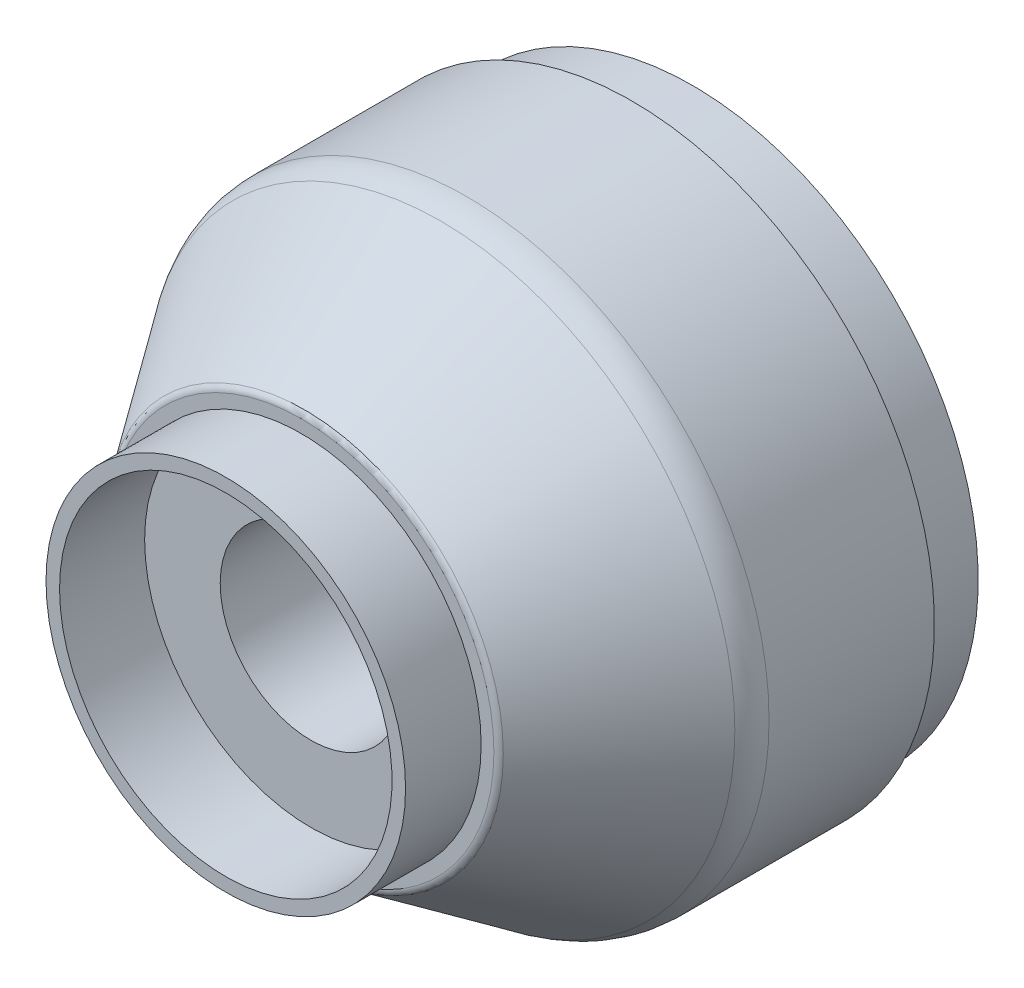
ISO-10303-21;
HEADER;
FILE_DESCRIPTION(('STEP AP214'),'2;1');
FILE_NAME('part.step','',(''),(''),'','','');
FILE_SCHEMA(('AUTOMOTIVE_DESIGN { 1 0 10303 214 1 1 1 1 }'));
ENDSEC;
DATA;
#1=APPLICATION_CONTEXT('core data for automotive mechanical design processes');
#2=APPLICATION_PROTOCOL_DEFINITION('international standard','automotive_design',2000,#1);
#3=PRODUCT_CONTEXT('',#1,'mechanical');
#4=PRODUCT('Part','Part','',(#3));
#5=PRODUCT_RELATED_PRODUCT_CATEGORY('part','',(#4));
#6=PRODUCT_DEFINITION_FORMATION('','',#4);
#7=PRODUCT_DEFINITION_CONTEXT('part definition',#1,'design');
#8=PRODUCT_DEFINITION('design','',#6,#7);
#9=PRODUCT_DEFINITION_SHAPE('','',#8);
#10=(LENGTH_UNIT() NAMED_UNIT(*) SI_UNIT(.MILLI.,.METRE.));
#11=(NAMED_UNIT(*) PLANE_ANGLE_UNIT() SI_UNIT($,.RADIAN.));
#12=(NAMED_UNIT(*) SI_UNIT($,.STERADIAN.) SOLID_ANGLE_UNIT());
#13=UNCERTAINTY_MEASURE_WITH_UNIT(LENGTH_MEASURE(1.E-05),#10,'distance_accuracy_value','');
#14=(GEOMETRIC_REPRESENTATION_CONTEXT(3) GLOBAL_UNCERTAINTY_ASSIGNED_CONTEXT((#13)) GLOBAL_UNIT_ASSIGNED_CONTEXT((#10,
#11,#12)) REPRESENTATION_CONTEXT('',''));
#15=CARTESIAN_POINT('',(0.,0.,0.));
#16=DIRECTION('',(0.,0.,1.));
#17=DIRECTION('',(1.,0.,0.));
#18=AXIS2_PLACEMENT_3D('',#15,#16,#17);
#19=CARTESIAN_POINT('',(0.,0.,18.));
#20=DIRECTION('',(0.,0.,-1.));
#21=DIRECTION('',(-1.,0.,0.));
#22=AXIS2_PLACEMENT_3D('',#19,#20,#21);
#23=PLANE('',#22);
#24=CARTESIAN_POINT('',(0.,0.,18.));
#25=DIRECTION('',(0.,0.,-1.));
#26=DIRECTION('',(-1.,0.,0.));
#27=AXIS2_PLACEMENT_3D('',#24,#25,#26);
#28=CIRCLE('',#27,16.25);
#29=CARTESIAN_POINT('',(-16.25,0.,18.));
#30=VERTEX_POINT('',#29);
#31=EDGE_CURVE('E124',#30,#30,#28,.T.);
#32=ORIENTED_EDGE('',*,*,#31,.T.);
#33=EDGE_LOOP('',(#32));
#34=FACE_BOUND('',#33,.T.);
#35=CARTESIAN_POINT('',(0.,0.,18.));
#36=DIRECTION('',(0.,0.,-1.));
#37=DIRECTION('',(-1.,0.,0.));
#38=AXIS2_PLACEMENT_3D('',#35,#36,#37);
#39=CIRCLE('',#38,6.);
#40=CARTESIAN_POINT('',(-6.,0.,18.));
#41=VERTEX_POINT('',#40);
#42=EDGE_CURVE('E79',#41,#41,#39,.T.);
#43=ORIENTED_EDGE('',*,*,#42,.F.);
#44=EDGE_LOOP('',(#43));
#45=FACE_BOUND('',#44,.T.);
#46=ADVANCED_FACE('F49',(#34,#45),#23,.T.);
#47=CARTESIAN_POINT('',(0.,0.,0.));
#48=DIRECTION('',(0.,0.,-1.));
#49=DIRECTION('',(-1.,0.,0.));
#50=AXIS2_PLACEMENT_3D('',#47,#48,#49);
#51=CYLINDRICAL_SURFACE('',#50,6.);
#52=ORIENTED_EDGE('',*,*,#42,.T.);
#53=EDGE_LOOP('',(#52));
#54=FACE_BOUND('',#53,.T.);
#55=CARTESIAN_POINT('',(0.,0.,26.));
#56=DIRECTION('',(0.,0.,-1.));
#57=DIRECTION('',(-1.,0.,0.));
#58=AXIS2_PLACEMENT_3D('',#55,#56,#57);
#59=CIRCLE('',#58,6.);
#60=CARTESIAN_POINT('',(-6.,0.,26.));
#61=VERTEX_POINT('',#60);
#62=EDGE_CURVE('E83',#61,#61,#59,.T.);
#63=ORIENTED_EDGE('',*,*,#62,.F.);
#64=EDGE_LOOP('',(#63));
#65=FACE_BOUND('',#64,.T.);
#66=ADVANCED_FACE('F146',(#54,#65),#51,.F.);
#67=CARTESIAN_POINT('',(0.,0.,26.));
#68=DIRECTION('',(0.,0.,1.));
#69=DIRECTION('',(1.,0.,0.));
#70=AXIS2_PLACEMENT_3D('',#67,#68,#69);
#71=PLANE('',#70);
#72=ORIENTED_EDGE('',*,*,#62,.T.);
#73=EDGE_LOOP('',(#72));
#74=FACE_BOUND('',#73,.T.);
#75=CARTESIAN_POINT('',(0.,0.,26.));
#76=DIRECTION('',(0.,0.,-1.));
#77=DIRECTION('',(-1.,0.,0.));
#78=AXIS2_PLACEMENT_3D('',#75,#76,#77);
#79=CIRCLE('',#78,11.);
#80=CARTESIAN_POINT('',(-11.,0.,26.));
#81=VERTEX_POINT('',#80);
#82=EDGE_CURVE('E87',#81,#81,#79,.T.);
#83=ORIENTED_EDGE('',*,*,#82,.F.);
#84=EDGE_LOOP('',(#83));
#85=FACE_BOUND('',#84,.T.);
#86=ADVANCED_FACE('F151',(#74,#85),#71,.T.);
#87=CARTESIAN_POINT('',(0.,0.,0.));
#88=DIRECTION('',(0.,0.,-1.));
#89=DIRECTION('',(-1.,0.,0.));
#90=AXIS2_PLACEMENT_3D('',#87,#88,#89);
#91=CYLINDRICAL_SURFACE('',#90,11.);
#92=CARTESIAN_POINT('',(0.,0.,31.6304444616382));
#93=DIRECTION('',(0.,0.,-1.));
#94=DIRECTION('',(-1.,0.,0.));
#95=AXIS2_PLACEMENT_3D('',#92,#93,#94);
#96=CIRCLE('',#95,11.);
#97=CARTESIAN_POINT('',(-11.,0.,31.6304444616382));
#98=VERTEX_POINT('',#97);
#99=EDGE_CURVE('E91',#98,#98,#96,.T.);
#100=ORIENTED_EDGE('',*,*,#99,.F.);
#101=EDGE_LOOP('',(#100));
#102=FACE_BOUND('',#101,.T.);
#103=ORIENTED_EDGE('',*,*,#82,.T.);
#104=EDGE_LOOP('',(#103));
#105=FACE_BOUND('',#104,.T.);
#106=ADVANCED_FACE('F157',(#102,#105),#91,.F.);
#107=CARTESIAN_POINT('',(0.,0.,31.6304444616382));
#108=DIRECTION('',(0.,0.,-1.));
#109=DIRECTION('',(-1.,0.,0.));
#110=AXIS2_PLACEMENT_3D('',#107,#108,#109);
#111=PLANE('',#110);
#112=CARTESIAN_POINT('',(0.,0.,31.6304444616382));
#113=DIRECTION('',(0.,0.,-1.));
#114=DIRECTION('',(-1.,0.,0.));
#115=AXIS2_PLACEMENT_3D('',#112,#113,#114);
#116=CIRCLE('',#115,11.8956045);
#117=CARTESIAN_POINT('',(-11.8956045,0.,31.6304444616382));
#118=VERTEX_POINT('',#117);
#119=EDGE_CURVE('E95',#118,#118,#116,.T.);
#120=ORIENTED_EDGE('',*,*,#119,.F.);
#121=EDGE_LOOP('',(#120));
#122=FACE_BOUND('',#121,.T.);
#123=ORIENTED_EDGE('',*,*,#99,.T.);
#124=EDGE_LOOP('',(#123));
#125=FACE_BOUND('',#124,.T.);
#126=ADVANCED_FACE('F161',(#122,#125),#111,.F.);
#127=CARTESIAN_POINT('',(0.,0.,0.));
#128=DIRECTION('',(0.,0.,-1.));
#129=DIRECTION('',(-1.,0.,0.));
#130=AXIS2_PLACEMENT_3D('',#127,#128,#129);
#131=CYLINDRICAL_SURFACE('',#130,11.8956045);
#132=ORIENTED_EDGE('',*,*,#119,.T.);
#133=EDGE_LOOP('',(#132));
#134=FACE_BOUND('',#133,.T.);
#135=CARTESIAN_POINT('',(0.,0.,26.6304444616382));
#136=DIRECTION('',(0.,0.,-1.));
#137=DIRECTION('',(-1.,0.,0.));
#138=AXIS2_PLACEMENT_3D('',#135,#136,#137);
#139=CIRCLE('',#138,11.8956045);
#140=CARTESIAN_POINT('',(-11.8956045,0.,26.6304444616382));
#141=VERTEX_POINT('',#140);
#142=EDGE_CURVE('E99',#141,#141,#139,.T.);
#143=ORIENTED_EDGE('',*,*,#142,.F.);
#144=EDGE_LOOP('',(#143));
#145=FACE_BOUND('',#144,.T.);
#146=ADVANCED_FACE('F165',(#134,#145),#131,.T.);
#147=CARTESIAN_POINT('',(0.,0.,26.6304444616382));
#148=DIRECTION('',(0.,0.,1.));
#149=DIRECTION('',(1.,0.,0.));
#150=AXIS2_PLACEMENT_3D('',#147,#148,#149);
#151=PLANE('',#150);
#152=CARTESIAN_POINT('',(0.,0.,26.6304444616382));
#153=DIRECTION('',(0.,0.,1.));
#154=DIRECTION('',(1.,0.,0.));
#155=AXIS2_PLACEMENT_3D('',#152,#153,#154);
#156=CIRCLE('',#155,12.7396722192133);
#157=CARTESIAN_POINT('',(12.7396722192133,0.,26.6304444616382));
#158=VERTEX_POINT('',#157);
#159=EDGE_CURVE('E10',#158,#158,#156,.T.);
#160=ORIENTED_EDGE('',*,*,#159,.T.);
#161=EDGE_LOOP('',(#160));
#162=FACE_BOUND('',#161,.T.);
#163=ORIENTED_EDGE('',*,*,#142,.T.);
#164=EDGE_LOOP('',(#163));
#165=FACE_BOUND('',#164,.T.);
#166=ADVANCED_FACE('F169',(#162,#165),#151,.T.);
#167=CARTESIAN_POINT('',(0.,0.,16.6304444616382));
#168=DIRECTION('',(0.,0.,-1.));
#169=DIRECTION('',(-1.,0.,0.));
#170=AXIS2_PLACEMENT_3D('',#167,#168,#169);
#171=CONICAL_SURFACE('',#170,20.,0.610725964389209);
#172=CARTESIAN_POINT('',(0.,0.,26.4171756338199));
#173=DIRECTION('',(0.,0.,1.));
#174=DIRECTION('',(1.,0.,0.));
#175=AXIS2_PLACEMENT_3D('',#172,#173,#174);
#176=CIRCLE('',#175,13.1492881794728);
#177=CARTESIAN_POINT('',(13.1492881794728,0.,26.4171756338199));
#178=VERTEX_POINT('',#177);
#179=EDGE_CURVE('E57',#178,#178,#176,.F.);
#180=ORIENTED_EDGE('',*,*,#179,.T.);
#181=EDGE_LOOP('',(#180));
#182=FACE_BOUND('',#181,.T.);
#183=CARTESIAN_POINT('',(0.,0.,17.4051648022709));
#184=DIRECTION('',(0.,0.,1.));
#185=DIRECTION('',(1.,0.,0.));
#186=AXIS2_PLACEMENT_3D('',#183,#184,#185);
#187=CIRCLE('',#186,19.4576957615571);
#188=CARTESIAN_POINT('',(19.4576957615571,0.,17.4051648022709));
#189=VERTEX_POINT('',#188);
#190=EDGE_CURVE('E65',#189,#189,#187,.T.);
#191=ORIENTED_EDGE('',*,*,#190,.T.);
#192=EDGE_LOOP('',(#191));
#193=FACE_BOUND('',#192,.T.);
#194=ADVANCED_FACE('F173',(#182,#193),#171,.T.);
#195=CARTESIAN_POINT('',(0.,0.,0.));
#196=DIRECTION('',(0.,0.,-1.));
#197=DIRECTION('',(-1.,0.,0.));
#198=AXIS2_PLACEMENT_3D('',#195,#196,#197);
#199=CYLINDRICAL_SURFACE('',#198,20.);
#200=CARTESIAN_POINT('',(0.,0.,15.6847777691809));
#201=DIRECTION('',(0.,0.,1.));
#202=DIRECTION('',(1.,0.,0.));
#203=AXIS2_PLACEMENT_3D('',#200,#201,#202);
#204=CIRCLE('',#203,20.);
#205=CARTESIAN_POINT('',(20.,0.,15.6847777691809));
#206=VERTEX_POINT('',#205);
#207=EDGE_CURVE('E73',#206,#206,#204,.F.);
#208=ORIENTED_EDGE('',*,*,#207,.T.);
#209=EDGE_LOOP('',(#208));
#210=FACE_BOUND('',#209,.T.);
#211=CARTESIAN_POINT('',(0.,0.,4.74190248110001));
#212=DIRECTION('',(0.,0.,-1.));
#213=DIRECTION('',(-1.,0.,0.));
#214=AXIS2_PLACEMENT_3D('',#211,#212,#213);
#215=CIRCLE('',#214,20.);
#216=CARTESIAN_POINT('',(-20.,0.,4.74190248110001));
#217=VERTEX_POINT('',#216);
#218=EDGE_CURVE('E102',#217,#217,#215,.T.);
#219=ORIENTED_EDGE('',*,*,#218,.F.);
#220=EDGE_LOOP('',(#219));
#221=FACE_BOUND('',#220,.T.);
#222=ADVANCED_FACE('F176',(#210,#221),#199,.T.);
#223=CARTESIAN_POINT('',(0.,0.,4.74190248110001));
#224=DIRECTION('',(0.,0.,1.));
#225=DIRECTION('',(1.,0.,0.));
#226=AXIS2_PLACEMENT_3D('',#223,#224,#225);
#227=PLANE('',#226);
#228=CARTESIAN_POINT('',(0.,0.,4.74190248110001));
#229=DIRECTION('',(0.,0.,-1.));
#230=DIRECTION('',(-1.,0.,0.));
#231=AXIS2_PLACEMENT_3D('',#228,#229,#230);
#232=CIRCLE('',#231,18.8956045);
#233=CARTESIAN_POINT('',(-18.8956045,0.,4.74190248110001));
#234=VERTEX_POINT('',#233);
#235=EDGE_CURVE('E106',#234,#234,#232,.T.);
#236=ORIENTED_EDGE('',*,*,#235,.F.);
#237=EDGE_LOOP('',(#236));
#238=FACE_BOUND('',#237,.T.);
#239=ORIENTED_EDGE('',*,*,#218,.T.);
#240=EDGE_LOOP('',(#239));
#241=FACE_BOUND('',#240,.T.);
#242=ADVANCED_FACE('F179',(#238,#241),#227,.F.);
#243=CARTESIAN_POINT('',(0.,0.,0.));
#244=DIRECTION('',(0.,0.,-1.));
#245=DIRECTION('',(-1.,0.,0.));
#246=AXIS2_PLACEMENT_3D('',#243,#244,#245);
#247=CYLINDRICAL_SURFACE('',#246,18.8956045);
#248=CARTESIAN_POINT('',(0.,0.,0.741902481100006));
#249=DIRECTION('',(0.,0.,-1.));
#250=DIRECTION('',(-1.,0.,0.));
#251=AXIS2_PLACEMENT_3D('',#248,#249,#250);
#252=CIRCLE('',#251,18.8956045);
#253=CARTESIAN_POINT('',(-18.8956045,0.,0.741902481100006));
#254=VERTEX_POINT('',#253);
#255=EDGE_CURVE('E110',#254,#254,#252,.T.);
#256=ORIENTED_EDGE('',*,*,#255,.F.);
#257=EDGE_LOOP('',(#256));
#258=FACE_BOUND('',#257,.T.);
#259=ORIENTED_EDGE('',*,*,#235,.T.);
#260=EDGE_LOOP('',(#259));
#261=FACE_BOUND('',#260,.T.);
#262=ADVANCED_FACE('F183',(#258,#261),#247,.T.);
#263=CARTESIAN_POINT('',(0.,0.,0.741902481100006));
#264=DIRECTION('',(0.,0.,-1.));
#265=DIRECTION('',(-1.,0.,0.));
#266=AXIS2_PLACEMENT_3D('',#263,#264,#265);
#267=PLANE('',#266);
#268=ORIENTED_EDGE('',*,*,#255,.T.);
#269=EDGE_LOOP('',(#268));
#270=FACE_BOUND('',#269,.T.);
#271=CARTESIAN_POINT('',(0.,0.,0.741902481100006));
#272=DIRECTION('',(0.,0.,-1.));
#273=DIRECTION('',(-1.,0.,0.));
#274=AXIS2_PLACEMENT_3D('',#271,#272,#273);
#275=CIRCLE('',#274,18.);
#276=CARTESIAN_POINT('',(-18.,0.,0.741902481100006));
#277=VERTEX_POINT('',#276);
#278=EDGE_CURVE('E113',#277,#277,#275,.T.);
#279=ORIENTED_EDGE('',*,*,#278,.F.);
#280=EDGE_LOOP('',(#279));
#281=FACE_BOUND('',#280,.T.);
#282=ADVANCED_FACE('F187',(#270,#281),#267,.T.);
#283=CARTESIAN_POINT('',(0.,0.,0.));
#284=DIRECTION('',(0.,0.,-1.));
#285=DIRECTION('',(-1.,0.,0.));
#286=AXIS2_PLACEMENT_3D('',#283,#284,#285);
#287=CYLINDRICAL_SURFACE('',#286,18.);
#288=CARTESIAN_POINT('',(0.,0.,3.95));
#289=DIRECTION('',(0.,0.,-1.));
#290=DIRECTION('',(-1.,0.,0.));
#291=AXIS2_PLACEMENT_3D('',#288,#289,#290);
#292=CIRCLE('',#291,18.);
#293=CARTESIAN_POINT('',(-18.,0.,3.95));
#294=VERTEX_POINT('',#293);
#295=EDGE_CURVE('E117',#294,#294,#292,.T.);
#296=ORIENTED_EDGE('',*,*,#295,.F.);
#297=EDGE_LOOP('',(#296));
#298=FACE_BOUND('',#297,.T.);
#299=ORIENTED_EDGE('',*,*,#278,.T.);
#300=EDGE_LOOP('',(#299));
#301=FACE_BOUND('',#300,.T.);
#302=ADVANCED_FACE('F142',(#298,#301),#287,.F.);
#303=CARTESIAN_POINT('',(0.,0.,16.));
#304=DIRECTION('',(0.,0.,-1.));
#305=DIRECTION('',(-1.,0.,0.));
#306=AXIS2_PLACEMENT_3D('',#303,#304,#305);
#307=CONICAL_SURFACE('',#306,16.25,0.144219930797927);
#308=ORIENTED_EDGE('',*,*,#295,.T.);
#309=EDGE_LOOP('',(#308));
#310=FACE_BOUND('',#309,.T.);
#311=CARTESIAN_POINT('',(0.,0.,16.));
#312=DIRECTION('',(0.,0.,-1.));
#313=DIRECTION('',(-1.,0.,0.));
#314=AXIS2_PLACEMENT_3D('',#311,#312,#313);
#315=CIRCLE('',#314,16.25);
#316=CARTESIAN_POINT('',(-16.25,0.,16.));
#317=VERTEX_POINT('',#316);
#318=EDGE_CURVE('E120',#317,#317,#315,.T.);
#319=ORIENTED_EDGE('',*,*,#318,.F.);
#320=EDGE_LOOP('',(#319));
#321=FACE_BOUND('',#320,.T.);
#322=ADVANCED_FACE('F134',(#310,#321),#307,.F.);
#323=CARTESIAN_POINT('',(0.,0.,0.));
#324=DIRECTION('',(0.,0.,-1.));
#325=DIRECTION('',(-1.,0.,0.));
#326=AXIS2_PLACEMENT_3D('',#323,#324,#325);
#327=CYLINDRICAL_SURFACE('',#326,16.25);
#328=ORIENTED_EDGE('',*,*,#318,.T.);
#329=EDGE_LOOP('',(#328));
#330=FACE_BOUND('',#329,.T.);
#331=ORIENTED_EDGE('',*,*,#31,.F.);
#332=EDGE_LOOP('',(#331));
#333=FACE_BOUND('',#332,.T.);
#334=ADVANCED_FACE('F131',(#330,#333),#327,.F.);
#335=CARTESIAN_POINT('',(0.,0.,15.6847777691809));
#336=DIRECTION('',(0.,0.,1.));
#337=DIRECTION('',(1.,0.,0.));
#338=AXIS2_PLACEMENT_3D('',#335,#336,#337);
#339=TOROIDAL_SURFACE('',#338,17.,3.);
#340=ORIENTED_EDGE('',*,*,#190,.F.);
#341=EDGE_LOOP('',(#340));
#342=FACE_BOUND('',#341,.T.);
#343=ORIENTED_EDGE('',*,*,#207,.F.);
#344=EDGE_LOOP('',(#343));
#345=FACE_BOUND('',#344,.T.);
#346=ADVANCED_FACE('F133',(#342,#345),#339,.T.);
#347=CARTESIAN_POINT('',(0.,0.,26.1304444616382));
#348=DIRECTION('',(0.,0.,1.));
#349=DIRECTION('',(1.,0.,0.));
#350=AXIS2_PLACEMENT_3D('',#347,#348,#349);
#351=TOROIDAL_SURFACE('',#350,12.7396722192133,0.5);
#352=ORIENTED_EDGE('',*,*,#159,.F.);
#353=EDGE_LOOP('',(#352));
#354=FACE_BOUND('',#353,.T.);
#355=ORIENTED_EDGE('',*,*,#179,.F.);
#356=EDGE_LOOP('',(#355));
#357=FACE_BOUND('',#356,.T.);
#358=ADVANCED_FACE('F51',(#354,#357),#351,.T.);
#359=CLOSED_SHELL('',(#46,#66,#86,#106,#126,#146,#166,#194,#222,#242,#262,#282,#302,#322,#334,
#346,#358));
#360=MANIFOLD_SOLID_BREP('B2',#359);
#361=ADVANCED_BREP_SHAPE_REPRESENTATION('',(#18,#360),#14);
#362=SHAPE_DEFINITION_REPRESENTATION(#9,#361);
ENDSEC;
END-ISO-10303-21;
